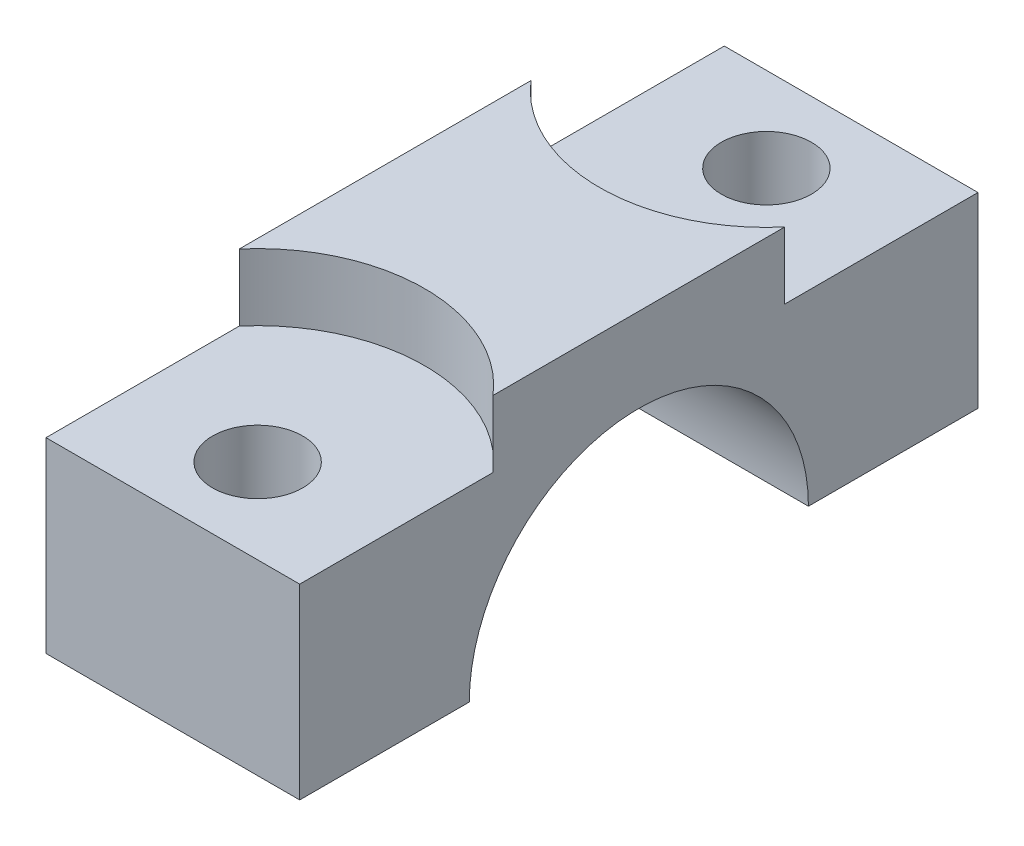
ISO-10303-21;
HEADER;
FILE_DESCRIPTION(('STEP AP214'),'2;1');
FILE_NAME('part.step','',(''),(''),'','','');
FILE_SCHEMA(('AUTOMOTIVE_DESIGN { 1 0 10303 214 1 1 1 1 }'));
ENDSEC;
DATA;
#1=APPLICATION_CONTEXT('core data for automotive mechanical design processes');
#2=APPLICATION_PROTOCOL_DEFINITION('international standard','automotive_design',2000,#1);
#3=PRODUCT_CONTEXT('',#1,'mechanical');
#4=PRODUCT('Part','Part','',(#3));
#5=PRODUCT_RELATED_PRODUCT_CATEGORY('part','',(#4));
#6=PRODUCT_DEFINITION_FORMATION('','',#4);
#7=PRODUCT_DEFINITION_CONTEXT('part definition',#1,'design');
#8=PRODUCT_DEFINITION('design','',#6,#7);
#9=PRODUCT_DEFINITION_SHAPE('','',#8);
#10=(LENGTH_UNIT() NAMED_UNIT(*) SI_UNIT(.MILLI.,.METRE.));
#11=(NAMED_UNIT(*) PLANE_ANGLE_UNIT() SI_UNIT($,.RADIAN.));
#12=(NAMED_UNIT(*) SI_UNIT($,.STERADIAN.) SOLID_ANGLE_UNIT());
#13=UNCERTAINTY_MEASURE_WITH_UNIT(LENGTH_MEASURE(1.E-05),#10,'distance_accuracy_value','');
#14=(GEOMETRIC_REPRESENTATION_CONTEXT(3) GLOBAL_UNCERTAINTY_ASSIGNED_CONTEXT((#13)) GLOBAL_UNIT_ASSIGNED_CONTEXT((#10,
#11,#12)) REPRESENTATION_CONTEXT('',''));
#15=CARTESIAN_POINT('',(0.,0.,0.));
#16=DIRECTION('',(0.,0.,1.));
#17=DIRECTION('',(1.,0.,0.));
#18=AXIS2_PLACEMENT_3D('',#15,#16,#17);
#19=CARTESIAN_POINT('',(9.5,19.,25.4));
#20=DIRECTION('',(0.,0.,-1.));
#21=DIRECTION('',(0.,1.,0.));
#22=AXIS2_PLACEMENT_3D('',#19,#20,#21);
#23=PLANE('',#22);
#24=DIRECTION('',(0.,-1.,0.));
#25=VECTOR('',#24,1.);
#26=CARTESIAN_POINT('',(9.5,19.,25.4));
#27=LINE('',#26,#25);
#28=CARTESIAN_POINT('',(9.5,14.,25.4));
#29=VERTEX_POINT('',#28);
#30=CARTESIAN_POINT('',(9.5,0.,25.4));
#31=VERTEX_POINT('',#30);
#32=EDGE_CURVE('E180',#29,#31,#27,.T.);
#33=ORIENTED_EDGE('',*,*,#32,.F.);
#34=DIRECTION('',(-1.,0.,0.));
#35=VECTOR('',#34,1.);
#36=CARTESIAN_POINT('',(9.5,14.,25.4));
#37=LINE('',#36,#35);
#38=CARTESIAN_POINT('',(-9.5,14.,25.4));
#39=VERTEX_POINT('',#38);
#40=EDGE_CURVE('E209',#29,#39,#37,.T.);
#41=ORIENTED_EDGE('',*,*,#40,.T.);
#42=DIRECTION('',(0.,-1.,0.));
#43=VECTOR('',#42,1.);
#44=CARTESIAN_POINT('',(-9.5,19.,25.4));
#45=LINE('',#44,#43);
#46=CARTESIAN_POINT('',(-9.5,0.,25.4));
#47=VERTEX_POINT('',#46);
#48=EDGE_CURVE('E160',#39,#47,#45,.T.);
#49=ORIENTED_EDGE('',*,*,#48,.T.);
#50=DIRECTION('',(-1.,0.,0.));
#51=VECTOR('',#50,1.);
#52=CARTESIAN_POINT('',(9.5,0.,25.4));
#53=LINE('',#52,#51);
#54=EDGE_CURVE('E191',#31,#47,#53,.T.);
#55=ORIENTED_EDGE('',*,*,#54,.F.);
#56=EDGE_LOOP('',(#33,#41,#49,#55));
#57=FACE_BOUND('',#56,.T.);
#58=ADVANCED_FACE('F45',(#57),#23,.F.);
#59=CARTESIAN_POINT('',(9.5,0.,25.4));
#60=DIRECTION('',(0.,1.,0.));
#61=DIRECTION('',(0.,0.,1.));
#62=AXIS2_PLACEMENT_3D('',#59,#60,#61);
#63=PLANE('',#62);
#64=DIRECTION('',(0.,0.,-1.));
#65=VECTOR('',#64,1.);
#66=CARTESIAN_POINT('',(-9.5,0.,25.4));
#67=LINE('',#66,#65);
#68=CARTESIAN_POINT('',(-9.5,0.,12.7));
#69=VERTEX_POINT('',#68);
#70=EDGE_CURVE('E163',#47,#69,#67,.T.);
#71=ORIENTED_EDGE('',*,*,#70,.T.);
#72=DIRECTION('',(-1.,0.,0.));
#73=VECTOR('',#72,1.);
#74=CARTESIAN_POINT('',(9.5,0.,12.7));
#75=LINE('',#74,#73);
#76=CARTESIAN_POINT('',(9.5,0.,12.7));
#77=VERTEX_POINT('',#76);
#78=EDGE_CURVE('E187',#77,#69,#75,.T.);
#79=ORIENTED_EDGE('',*,*,#78,.F.);
#80=DIRECTION('',(0.,0.,-1.));
#81=VECTOR('',#80,1.);
#82=CARTESIAN_POINT('',(9.5,0.,25.4));
#83=LINE('',#82,#81);
#84=EDGE_CURVE('E212',#31,#77,#83,.T.);
#85=ORIENTED_EDGE('',*,*,#84,.F.);
#86=ORIENTED_EDGE('',*,*,#54,.T.);
#87=EDGE_LOOP('',(#71,#79,#85,#86));
#88=FACE_BOUND('',#87,.T.);
#89=ADVANCED_FACE('F275',(#88),#63,.F.);
#90=CARTESIAN_POINT('',(9.5,0.,0.));
#91=DIRECTION('',(-1.,0.,0.));
#92=DIRECTION('',(0.,0.,1.));
#93=AXIS2_PLACEMENT_3D('',#90,#91,#92);
#94=CYLINDRICAL_SURFACE('',#93,12.7);
#95=CARTESIAN_POINT('',(-9.5,0.,0.));
#96=DIRECTION('',(-1.,0.,0.));
#97=DIRECTION('',(0.,0.,1.));
#98=AXIS2_PLACEMENT_3D('',#95,#96,#97);
#99=CIRCLE('',#98,12.7);
#100=CARTESIAN_POINT('',(-9.5,0.,-12.7));
#101=VERTEX_POINT('',#100);
#102=EDGE_CURVE('E167',#69,#101,#99,.T.);
#103=ORIENTED_EDGE('',*,*,#102,.T.);
#104=DIRECTION('',(-1.,0.,0.));
#105=VECTOR('',#104,1.);
#106=CARTESIAN_POINT('',(9.5,0.,-12.7));
#107=LINE('',#106,#105);
#108=CARTESIAN_POINT('',(9.5,0.,-12.7));
#109=VERTEX_POINT('',#108);
#110=EDGE_CURVE('E183',#109,#101,#107,.T.);
#111=ORIENTED_EDGE('',*,*,#110,.F.);
#112=CARTESIAN_POINT('',(9.5,0.,0.));
#113=DIRECTION('',(-1.,0.,0.));
#114=DIRECTION('',(0.,0.,1.));
#115=AXIS2_PLACEMENT_3D('',#112,#113,#114);
#116=CIRCLE('',#115,12.7);
#117=EDGE_CURVE('E156',#77,#109,#116,.T.);
#118=ORIENTED_EDGE('',*,*,#117,.F.);
#119=ORIENTED_EDGE('',*,*,#78,.T.);
#120=EDGE_LOOP('',(#103,#111,#118,#119));
#121=FACE_BOUND('',#120,.T.);
#122=ADVANCED_FACE('F227',(#121),#94,.F.);
#123=CARTESIAN_POINT('',(9.5,0.,-12.7));
#124=DIRECTION('',(0.,1.,0.));
#125=DIRECTION('',(0.,0.,1.));
#126=AXIS2_PLACEMENT_3D('',#123,#124,#125);
#127=PLANE('',#126);
#128=DIRECTION('',(0.,0.,-1.));
#129=VECTOR('',#128,1.);
#130=CARTESIAN_POINT('',(-9.5,0.,-12.7));
#131=LINE('',#130,#129);
#132=CARTESIAN_POINT('',(-9.5,0.,-25.4));
#133=VERTEX_POINT('',#132);
#134=EDGE_CURVE('E170',#101,#133,#131,.T.);
#135=ORIENTED_EDGE('',*,*,#134,.T.);
#136=DIRECTION('',(-1.,0.,0.));
#137=VECTOR('',#136,1.);
#138=CARTESIAN_POINT('',(9.5,0.,-25.4));
#139=LINE('',#138,#137);
#140=CARTESIAN_POINT('',(9.5,0.,-25.4));
#141=VERTEX_POINT('',#140);
#142=EDGE_CURVE('E154',#141,#133,#139,.T.);
#143=ORIENTED_EDGE('',*,*,#142,.F.);
#144=DIRECTION('',(0.,0.,-1.));
#145=VECTOR('',#144,1.);
#146=CARTESIAN_POINT('',(9.5,0.,-12.7));
#147=LINE('',#146,#145);
#148=EDGE_CURVE('E143',#109,#141,#147,.T.);
#149=ORIENTED_EDGE('',*,*,#148,.F.);
#150=ORIENTED_EDGE('',*,*,#110,.T.);
#151=EDGE_LOOP('',(#135,#143,#149,#150));
#152=FACE_BOUND('',#151,.T.);
#153=ADVANCED_FACE('F231',(#152),#127,.F.);
#154=CARTESIAN_POINT('',(9.5,19.,-25.4));
#155=DIRECTION('',(0.,0.,1.));
#156=DIRECTION('',(0.,-1.,0.));
#157=AXIS2_PLACEMENT_3D('',#154,#155,#156);
#158=PLANE('',#157);
#159=DIRECTION('',(0.,1.,0.));
#160=VECTOR('',#159,1.);
#161=CARTESIAN_POINT('',(-9.5,19.,-25.4));
#162=LINE('',#161,#160);
#163=CARTESIAN_POINT('',(-9.5,14.,-25.4));
#164=VERTEX_POINT('',#163);
#165=EDGE_CURVE('E173',#133,#164,#162,.T.);
#166=ORIENTED_EDGE('',*,*,#165,.T.);
#167=DIRECTION('',(1.,0.,0.));
#168=VECTOR('',#167,1.);
#169=CARTESIAN_POINT('',(9.5,14.,-25.4));
#170=LINE('',#169,#168);
#171=CARTESIAN_POINT('',(9.5,14.,-25.4));
#172=VERTEX_POINT('',#171);
#173=EDGE_CURVE('E240',#164,#172,#170,.T.);
#174=ORIENTED_EDGE('',*,*,#173,.T.);
#175=DIRECTION('',(0.,1.,0.));
#176=VECTOR('',#175,1.);
#177=CARTESIAN_POINT('',(9.5,19.,-25.4));
#178=LINE('',#177,#176);
#179=EDGE_CURVE('E141',#141,#172,#178,.T.);
#180=ORIENTED_EDGE('',*,*,#179,.F.);
#181=ORIENTED_EDGE('',*,*,#142,.T.);
#182=EDGE_LOOP('',(#166,#174,#180,#181));
#183=FACE_BOUND('',#182,.T.);
#184=ADVANCED_FACE('F233',(#183),#158,.F.);
#185=CARTESIAN_POINT('',(9.5,19.,25.4));
#186=DIRECTION('',(0.,-1.,0.));
#187=DIRECTION('',(0.,0.,-1.));
#188=AXIS2_PLACEMENT_3D('',#185,#186,#187);
#189=PLANE('',#188);
#190=DIRECTION('',(0.,0.,1.));
#191=VECTOR('',#190,1.);
#192=CARTESIAN_POINT('',(9.5,19.,25.4));
#193=LINE('',#192,#191);
#194=CARTESIAN_POINT('',(9.5,19.,-10.925961595364));
#195=VERTEX_POINT('',#194);
#196=CARTESIAN_POINT('',(9.5,19.,10.925961595364));
#197=VERTEX_POINT('',#196);
#198=EDGE_CURVE('E148',#195,#197,#193,.T.);
#199=ORIENTED_EDGE('',*,*,#198,.F.);
#200=CARTESIAN_POINT('',(0.,19.,-19.05));
#201=DIRECTION('',(0.,1.,0.));
#202=DIRECTION('',(0.,0.,1.));
#203=AXIS2_PLACEMENT_3D('',#200,#201,#202);
#204=CIRCLE('',#203,12.5);
#205=CARTESIAN_POINT('',(-9.5,19.,-10.925961595364));
#206=VERTEX_POINT('',#205);
#207=EDGE_CURVE('E60',#206,#195,#204,.T.);
#208=ORIENTED_EDGE('',*,*,#207,.F.);
#209=DIRECTION('',(0.,0.,1.));
#210=VECTOR('',#209,1.);
#211=CARTESIAN_POINT('',(-9.5,19.,25.4));
#212=LINE('',#211,#210);
#213=CARTESIAN_POINT('',(-9.5,19.,10.925961595364));
#214=VERTEX_POINT('',#213);
#215=EDGE_CURVE('E177',#206,#214,#212,.T.);
#216=ORIENTED_EDGE('',*,*,#215,.T.);
#217=CARTESIAN_POINT('',(0.,19.,19.05));
#218=DIRECTION('',(0.,1.,0.));
#219=DIRECTION('',(0.,0.,1.));
#220=AXIS2_PLACEMENT_3D('',#217,#218,#219);
#221=CIRCLE('',#220,12.5);
#222=EDGE_CURVE('E239',#197,#214,#221,.T.);
#223=ORIENTED_EDGE('',*,*,#222,.F.);
#224=EDGE_LOOP('',(#199,#208,#216,#223));
#225=FACE_BOUND('',#224,.T.);
#226=ADVANCED_FACE('F287',(#225),#189,.F.);
#227=CARTESIAN_POINT('',(9.5,0.,0.));
#228=DIRECTION('',(-1.,0.,0.));
#229=DIRECTION('',(0.,0.,1.));
#230=AXIS2_PLACEMENT_3D('',#227,#228,#229);
#231=PLANE('',#230);
#232=ORIENTED_EDGE('',*,*,#179,.T.);
#233=DIRECTION('',(0.,0.,1.));
#234=VECTOR('',#233,1.);
#235=CARTESIAN_POINT('',(9.5,14.,0.));
#236=LINE('',#235,#234);
#237=CARTESIAN_POINT('',(9.5,14.,-10.925961595364));
#238=VERTEX_POINT('',#237);
#239=EDGE_CURVE('E11',#172,#238,#236,.T.);
#240=ORIENTED_EDGE('',*,*,#239,.T.);
#241=DIRECTION('',(0.,1.,0.));
#242=VECTOR('',#241,1.);
#243=CARTESIAN_POINT('',(9.5,19.,-10.925961595364));
#244=LINE('',#243,#242);
#245=EDGE_CURVE('E53',#238,#195,#244,.T.);
#246=ORIENTED_EDGE('',*,*,#245,.T.);
#247=ORIENTED_EDGE('',*,*,#198,.T.);
#248=DIRECTION('',(0.,1.,0.));
#249=VECTOR('',#248,1.);
#250=CARTESIAN_POINT('',(9.5,19.,10.925961595364));
#251=LINE('',#250,#249);
#252=CARTESIAN_POINT('',(9.5,14.,10.925961595364));
#253=VERTEX_POINT('',#252);
#254=EDGE_CURVE('E195',#197,#253,#251,.F.);
#255=ORIENTED_EDGE('',*,*,#254,.T.);
#256=DIRECTION('',(0.,0.,1.));
#257=VECTOR('',#256,1.);
#258=CARTESIAN_POINT('',(9.5,14.,0.));
#259=LINE('',#258,#257);
#260=EDGE_CURVE('E128',#253,#29,#259,.T.);
#261=ORIENTED_EDGE('',*,*,#260,.T.);
#262=ORIENTED_EDGE('',*,*,#32,.T.);
#263=ORIENTED_EDGE('',*,*,#84,.T.);
#264=ORIENTED_EDGE('',*,*,#117,.T.);
#265=ORIENTED_EDGE('',*,*,#148,.T.);
#266=EDGE_LOOP('',(#232,#240,#246,#247,#255,#261,#262,#263,#264,#265));
#267=FACE_BOUND('',#266,.T.);
#268=ADVANCED_FACE('F139',(#267),#231,.F.);
#269=CARTESIAN_POINT('',(-9.5,0.,0.));
#270=DIRECTION('',(-1.,0.,0.));
#271=DIRECTION('',(0.,0.,1.));
#272=AXIS2_PLACEMENT_3D('',#269,#270,#271);
#273=PLANE('',#272);
#274=DIRECTION('',(0.,1.,0.));
#275=VECTOR('',#274,1.);
#276=CARTESIAN_POINT('',(-9.5,19.,-10.925961595364));
#277=LINE('',#276,#275);
#278=CARTESIAN_POINT('',(-9.5,14.,-10.925961595364));
#279=VERTEX_POINT('',#278);
#280=EDGE_CURVE('E237',#279,#206,#277,.T.);
#281=ORIENTED_EDGE('',*,*,#280,.F.);
#282=DIRECTION('',(0.,0.,1.));
#283=VECTOR('',#282,1.);
#284=CARTESIAN_POINT('',(-9.5,14.,0.));
#285=LINE('',#284,#283);
#286=EDGE_CURVE('E134',#164,#279,#285,.T.);
#287=ORIENTED_EDGE('',*,*,#286,.F.);
#288=ORIENTED_EDGE('',*,*,#165,.F.);
#289=ORIENTED_EDGE('',*,*,#134,.F.);
#290=ORIENTED_EDGE('',*,*,#102,.F.);
#291=ORIENTED_EDGE('',*,*,#70,.F.);
#292=ORIENTED_EDGE('',*,*,#48,.F.);
#293=DIRECTION('',(0.,0.,1.));
#294=VECTOR('',#293,1.);
#295=CARTESIAN_POINT('',(-9.5,14.,0.));
#296=LINE('',#295,#294);
#297=CARTESIAN_POINT('',(-9.5,14.,10.925961595364));
#298=VERTEX_POINT('',#297);
#299=EDGE_CURVE('E164',#298,#39,#296,.T.);
#300=ORIENTED_EDGE('',*,*,#299,.F.);
#301=DIRECTION('',(0.,1.,0.));
#302=VECTOR('',#301,1.);
#303=CARTESIAN_POINT('',(-9.5,19.,10.925961595364));
#304=LINE('',#303,#302);
#305=EDGE_CURVE('E261',#214,#298,#304,.F.);
#306=ORIENTED_EDGE('',*,*,#305,.F.);
#307=ORIENTED_EDGE('',*,*,#215,.F.);
#308=EDGE_LOOP('',(#281,#287,#288,#289,#290,#291,#292,#300,#306,#307));
#309=FACE_BOUND('',#308,.T.);
#310=ADVANCED_FACE('F235',(#309),#273,.T.);
#311=CARTESIAN_POINT('',(0.,2.49,19.05));
#312=DIRECTION('',(0.,-1.,0.));
#313=DIRECTION('',(0.,0.,-1.));
#314=AXIS2_PLACEMENT_3D('',#311,#312,#313);
#315=PLANE('',#314);
#316=CARTESIAN_POINT('',(0.,2.49000000000001,19.05));
#317=DIRECTION('',(0.,1.,0.));
#318=DIRECTION('',(0.,0.,1.));
#319=AXIS2_PLACEMENT_3D('',#316,#317,#318);
#320=CIRCLE('',#319,3.375);
#321=CARTESIAN_POINT('',(0.,2.49000000000001,22.425));
#322=VERTEX_POINT('',#321);
#323=EDGE_CURVE('E257',#322,#322,#320,.T.);
#324=ORIENTED_EDGE('',*,*,#323,.T.);
#325=EDGE_LOOP('',(#324));
#326=FACE_BOUND('',#325,.T.);
#327=ADVANCED_FACE('F293',(#326),#315,.F.);
#328=CARTESIAN_POINT('',(0.,19.,19.05));
#329=DIRECTION('',(0.,1.,0.));
#330=DIRECTION('',(0.,0.,1.));
#331=AXIS2_PLACEMENT_3D('',#328,#329,#330);
#332=CYLINDRICAL_SURFACE('',#331,3.375);
#333=ORIENTED_EDGE('',*,*,#323,.F.);
#334=EDGE_LOOP('',(#333));
#335=FACE_BOUND('',#334,.T.);
#336=CARTESIAN_POINT('',(0.,14.,19.05));
#337=DIRECTION('',(0.,1.,0.));
#338=DIRECTION('',(0.,0.,1.));
#339=AXIS2_PLACEMENT_3D('',#336,#337,#338);
#340=CIRCLE('',#339,3.375);
#341=CARTESIAN_POINT('',(0.,14.,22.425));
#342=VERTEX_POINT('',#341);
#343=EDGE_CURVE('E253',#342,#342,#340,.T.);
#344=ORIENTED_EDGE('',*,*,#343,.T.);
#345=EDGE_LOOP('',(#344));
#346=FACE_BOUND('',#345,.T.);
#347=ADVANCED_FACE('F298',(#335,#346),#332,.F.);
#348=CARTESIAN_POINT('',(3.375,14.,19.05));
#349=DIRECTION('',(0.,-1.,0.));
#350=DIRECTION('',(0.,0.,-1.));
#351=AXIS2_PLACEMENT_3D('',#348,#349,#350);
#352=PLANE('',#351);
#353=ORIENTED_EDGE('',*,*,#299,.T.);
#354=ORIENTED_EDGE('',*,*,#40,.F.);
#355=ORIENTED_EDGE('',*,*,#260,.F.);
#356=CARTESIAN_POINT('',(0.,14.,19.05));
#357=DIRECTION('',(0.,1.,0.));
#358=DIRECTION('',(0.,0.,1.));
#359=AXIS2_PLACEMENT_3D('',#356,#357,#358);
#360=CIRCLE('',#359,12.5);
#361=EDGE_CURVE('E68',#253,#298,#360,.T.);
#362=ORIENTED_EDGE('',*,*,#361,.T.);
#363=EDGE_LOOP('',(#353,#354,#355,#362));
#364=FACE_BOUND('',#363,.T.);
#365=ORIENTED_EDGE('',*,*,#343,.F.);
#366=EDGE_LOOP('',(#365));
#367=FACE_BOUND('',#366,.T.);
#368=ADVANCED_FACE('F270',(#364,#367),#352,.F.);
#369=CARTESIAN_POINT('',(0.,19.,19.05));
#370=DIRECTION('',(0.,1.,0.));
#371=DIRECTION('',(0.,0.,1.));
#372=AXIS2_PLACEMENT_3D('',#369,#370,#371);
#373=CYLINDRICAL_SURFACE('',#372,12.5);
#374=ORIENTED_EDGE('',*,*,#305,.T.);
#375=ORIENTED_EDGE('',*,*,#361,.F.);
#376=ORIENTED_EDGE('',*,*,#254,.F.);
#377=ORIENTED_EDGE('',*,*,#222,.T.);
#378=EDGE_LOOP('',(#374,#375,#376,#377));
#379=FACE_BOUND('',#378,.T.);
#380=ADVANCED_FACE('F305',(#379),#373,.F.);
#381=CARTESIAN_POINT('',(0.,2.49000000000001,-19.05));
#382=DIRECTION('',(0.,-1.,0.));
#383=DIRECTION('',(0.,0.,-1.));
#384=AXIS2_PLACEMENT_3D('',#381,#382,#383);
#385=PLANE('',#384);
#386=CARTESIAN_POINT('',(0.,2.49000000000001,-19.05));
#387=DIRECTION('',(0.,1.,0.));
#388=DIRECTION('',(0.,0.,1.));
#389=AXIS2_PLACEMENT_3D('',#386,#387,#388);
#390=CIRCLE('',#389,3.375);
#391=CARTESIAN_POINT('',(0.,2.49000000000001,-15.675));
#392=VERTEX_POINT('',#391);
#393=EDGE_CURVE('E448',#392,#392,#390,.T.);
#394=ORIENTED_EDGE('',*,*,#393,.T.);
#395=EDGE_LOOP('',(#394));
#396=FACE_BOUND('',#395,.T.);
#397=ADVANCED_FACE('F308',(#396),#385,.F.);
#398=CARTESIAN_POINT('',(0.,19.,-19.05));
#399=DIRECTION('',(0.,1.,0.));
#400=DIRECTION('',(0.,0.,1.));
#401=AXIS2_PLACEMENT_3D('',#398,#399,#400);
#402=CYLINDRICAL_SURFACE('',#401,3.375);
#403=ORIENTED_EDGE('',*,*,#393,.F.);
#404=EDGE_LOOP('',(#403));
#405=FACE_BOUND('',#404,.T.);
#406=CARTESIAN_POINT('',(0.,14.,-19.05));
#407=DIRECTION('',(0.,1.,0.));
#408=DIRECTION('',(0.,0.,1.));
#409=AXIS2_PLACEMENT_3D('',#406,#407,#408);
#410=CIRCLE('',#409,3.375);
#411=CARTESIAN_POINT('',(0.,14.,-15.675));
#412=VERTEX_POINT('',#411);
#413=EDGE_CURVE('E136',#412,#412,#410,.T.);
#414=ORIENTED_EDGE('',*,*,#413,.T.);
#415=EDGE_LOOP('',(#414));
#416=FACE_BOUND('',#415,.T.);
#417=ADVANCED_FACE('F311',(#405,#416),#402,.F.);
#418=CARTESIAN_POINT('',(3.375,14.,-19.05));
#419=DIRECTION('',(0.,-1.,0.));
#420=DIRECTION('',(0.,0.,-1.));
#421=AXIS2_PLACEMENT_3D('',#418,#419,#420);
#422=PLANE('',#421);
#423=ORIENTED_EDGE('',*,*,#286,.T.);
#424=CARTESIAN_POINT('',(0.,14.,-19.05));
#425=DIRECTION('',(0.,1.,0.));
#426=DIRECTION('',(0.,0.,1.));
#427=AXIS2_PLACEMENT_3D('',#424,#425,#426);
#428=CIRCLE('',#427,12.5);
#429=EDGE_CURVE('E123',#279,#238,#428,.T.);
#430=ORIENTED_EDGE('',*,*,#429,.T.);
#431=ORIENTED_EDGE('',*,*,#239,.F.);
#432=ORIENTED_EDGE('',*,*,#173,.F.);
#433=EDGE_LOOP('',(#423,#430,#431,#432));
#434=FACE_BOUND('',#433,.T.);
#435=ORIENTED_EDGE('',*,*,#413,.F.);
#436=EDGE_LOOP('',(#435));
#437=FACE_BOUND('',#436,.T.);
#438=ADVANCED_FACE('F130',(#434,#437),#422,.F.);
#439=CARTESIAN_POINT('',(0.,19.,-19.05));
#440=DIRECTION('',(0.,1.,0.));
#441=DIRECTION('',(0.,0.,1.));
#442=AXIS2_PLACEMENT_3D('',#439,#440,#441);
#443=CYLINDRICAL_SURFACE('',#442,12.5);
#444=ORIENTED_EDGE('',*,*,#280,.T.);
#445=ORIENTED_EDGE('',*,*,#207,.T.);
#446=ORIENTED_EDGE('',*,*,#245,.F.);
#447=ORIENTED_EDGE('',*,*,#429,.F.);
#448=EDGE_LOOP('',(#444,#445,#446,#447));
#449=FACE_BOUND('',#448,.T.);
#450=ADVANCED_FACE('F122',(#449),#443,.F.);
#451=CLOSED_SHELL('',(#58,#89,#122,#153,#184,#226,#268,#310,#327,#347,#368,#380,#397,#417,#438,#450));
#452=MANIFOLD_SOLID_BREP('B2',#451);
#453=ADVANCED_BREP_SHAPE_REPRESENTATION('',(#18,#452),#14);
#454=SHAPE_DEFINITION_REPRESENTATION(#9,#453);
ENDSEC;
END-ISO-10303-21;
